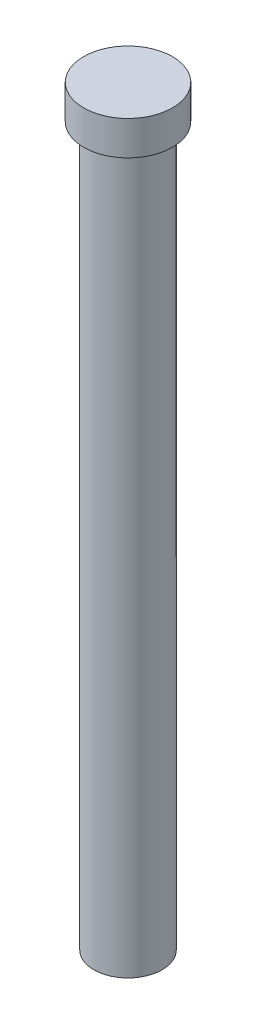
ISO-10303-21;
HEADER;
FILE_DESCRIPTION(('STEP AP214'),'2;1');
FILE_NAME('part.step','',(''),(''),'','','');
FILE_SCHEMA(('AUTOMOTIVE_DESIGN { 1 0 10303 214 1 1 1 1 }'));
ENDSEC;
DATA;
#1=APPLICATION_CONTEXT('core data for automotive mechanical design processes');
#2=APPLICATION_PROTOCOL_DEFINITION('international standard','automotive_design',2000,#1);
#3=PRODUCT_CONTEXT('',#1,'mechanical');
#4=PRODUCT('Part','Part','',(#3));
#5=PRODUCT_RELATED_PRODUCT_CATEGORY('part','',(#4));
#6=PRODUCT_DEFINITION_FORMATION('','',#4);
#7=PRODUCT_DEFINITION_CONTEXT('part definition',#1,'design');
#8=PRODUCT_DEFINITION('design','',#6,#7);
#9=PRODUCT_DEFINITION_SHAPE('','',#8);
#10=(LENGTH_UNIT() NAMED_UNIT(*) SI_UNIT(.MILLI.,.METRE.));
#11=(NAMED_UNIT(*) PLANE_ANGLE_UNIT() SI_UNIT($,.RADIAN.));
#12=(NAMED_UNIT(*) SI_UNIT($,.STERADIAN.) SOLID_ANGLE_UNIT());
#13=UNCERTAINTY_MEASURE_WITH_UNIT(LENGTH_MEASURE(1.E-05),#10,'distance_accuracy_value','');
#14=(GEOMETRIC_REPRESENTATION_CONTEXT(3) GLOBAL_UNCERTAINTY_ASSIGNED_CONTEXT((#13)) GLOBAL_UNIT_ASSIGNED_CONTEXT((#10,
#11,#12)) REPRESENTATION_CONTEXT('',''));
#15=CARTESIAN_POINT('',(0.,0.,0.));
#16=DIRECTION('',(0.,0.,1.));
#17=DIRECTION('',(1.,0.,0.));
#18=AXIS2_PLACEMENT_3D('',#15,#16,#17);
#19=CARTESIAN_POINT('',(0.,0.,0.));
#20=DIRECTION('',(0.,1.,0.));
#21=DIRECTION('',(0.,0.,1.));
#22=AXIS2_PLACEMENT_3D('',#19,#20,#21);
#23=PLANE('',#22);
#24=CARTESIAN_POINT('',(0.,0.,0.));
#25=DIRECTION('',(0.,-1.,0.));
#26=DIRECTION('',(0.,0.,-1.));
#27=AXIS2_PLACEMENT_3D('',#24,#25,#26);
#28=CIRCLE('',#27,6.5);
#29=CARTESIAN_POINT('',(0.,0.,-6.5));
#30=VERTEX_POINT('',#29);
#31=EDGE_CURVE('E10',#30,#30,#28,.T.);
#32=ORIENTED_EDGE('',*,*,#31,.F.);
#33=EDGE_LOOP('',(#32));
#34=FACE_BOUND('',#33,.T.);
#35=ADVANCED_FACE('F41',(#34),#23,.T.);
#36=CARTESIAN_POINT('',(0.,-115.,0.));
#37=DIRECTION('',(0.,-1.,0.));
#38=DIRECTION('',(0.,0.,-1.));
#39=AXIS2_PLACEMENT_3D('',#36,#37,#38);
#40=CYLINDRICAL_SURFACE('',#39,6.5);
#41=ORIENTED_EDGE('',*,*,#31,.T.);
#42=EDGE_LOOP('',(#41));
#43=FACE_BOUND('',#42,.T.);
#44=CARTESIAN_POINT('',(0.,-5.,0.));
#45=DIRECTION('',(0.,-1.,0.));
#46=DIRECTION('',(0.,0.,-1.));
#47=AXIS2_PLACEMENT_3D('',#44,#45,#46);
#48=CIRCLE('',#47,6.5);
#49=CARTESIAN_POINT('',(0.,-5.,-6.5));
#50=VERTEX_POINT('',#49);
#51=EDGE_CURVE('E48',#50,#50,#48,.T.);
#52=ORIENTED_EDGE('',*,*,#51,.F.);
#53=EDGE_LOOP('',(#52));
#54=FACE_BOUND('',#53,.T.);
#55=ADVANCED_FACE('F80',(#43,#54),#40,.T.);
#56=CARTESIAN_POINT('',(5.,-5.,0.));
#57=DIRECTION('',(0.,-1.,0.));
#58=DIRECTION('',(0.,0.,-1.));
#59=AXIS2_PLACEMENT_3D('',#56,#57,#58);
#60=PLANE('',#59);
#61=ORIENTED_EDGE('',*,*,#51,.T.);
#62=EDGE_LOOP('',(#61));
#63=FACE_BOUND('',#62,.T.);
#64=CARTESIAN_POINT('',(0.,-5.,0.));
#65=DIRECTION('',(0.,-1.,0.));
#66=DIRECTION('',(0.,0.,-1.));
#67=AXIS2_PLACEMENT_3D('',#64,#65,#66);
#68=CIRCLE('',#67,5.);
#69=CARTESIAN_POINT('',(0.,-5.,-5.));
#70=VERTEX_POINT('',#69);
#71=EDGE_CURVE('E54',#70,#70,#68,.T.);
#72=ORIENTED_EDGE('',*,*,#71,.F.);
#73=EDGE_LOOP('',(#72));
#74=FACE_BOUND('',#73,.T.);
#75=ADVANCED_FACE('F72',(#63,#74),#60,.T.);
#76=CARTESIAN_POINT('',(0.,-115.,0.));
#77=DIRECTION('',(0.,-1.,0.));
#78=DIRECTION('',(0.,0.,-1.));
#79=AXIS2_PLACEMENT_3D('',#76,#77,#78);
#80=CYLINDRICAL_SURFACE('',#79,5.00000000000001);
#81=ORIENTED_EDGE('',*,*,#71,.T.);
#82=EDGE_LOOP('',(#81));
#83=FACE_BOUND('',#82,.T.);
#84=CARTESIAN_POINT('',(0.,-110.,0.));
#85=DIRECTION('',(0.,-1.,0.));
#86=DIRECTION('',(0.,0.,-1.));
#87=AXIS2_PLACEMENT_3D('',#84,#85,#86);
#88=CIRCLE('',#87,5.00000000000001);
#89=CARTESIAN_POINT('',(0.,-110.,-5.00000000000001));
#90=VERTEX_POINT('',#89);
#91=EDGE_CURVE('E60',#90,#90,#88,.T.);
#92=ORIENTED_EDGE('',*,*,#91,.F.);
#93=EDGE_LOOP('',(#92));
#94=FACE_BOUND('',#93,.T.);
#95=ADVANCED_FACE('F70',(#83,#94),#80,.T.);
#96=CARTESIAN_POINT('',(5.00000000000001,-110.,0.));
#97=DIRECTION('',(0.,-1.,0.));
#98=DIRECTION('',(0.,0.,-1.));
#99=AXIS2_PLACEMENT_3D('',#96,#97,#98);
#100=PLANE('',#99);
#101=ORIENTED_EDGE('',*,*,#91,.T.);
#102=EDGE_LOOP('',(#101));
#103=FACE_BOUND('',#102,.T.);
#104=ADVANCED_FACE('F68',(#103),#100,.T.);
#105=CLOSED_SHELL('',(#35,#55,#75,#95,#104));
#106=MANIFOLD_SOLID_BREP('B2',#105);
#107=ADVANCED_BREP_SHAPE_REPRESENTATION('',(#18,#106),#14);
#108=SHAPE_DEFINITION_REPRESENTATION(#9,#107);
ENDSEC;
END-ISO-10303-21;
